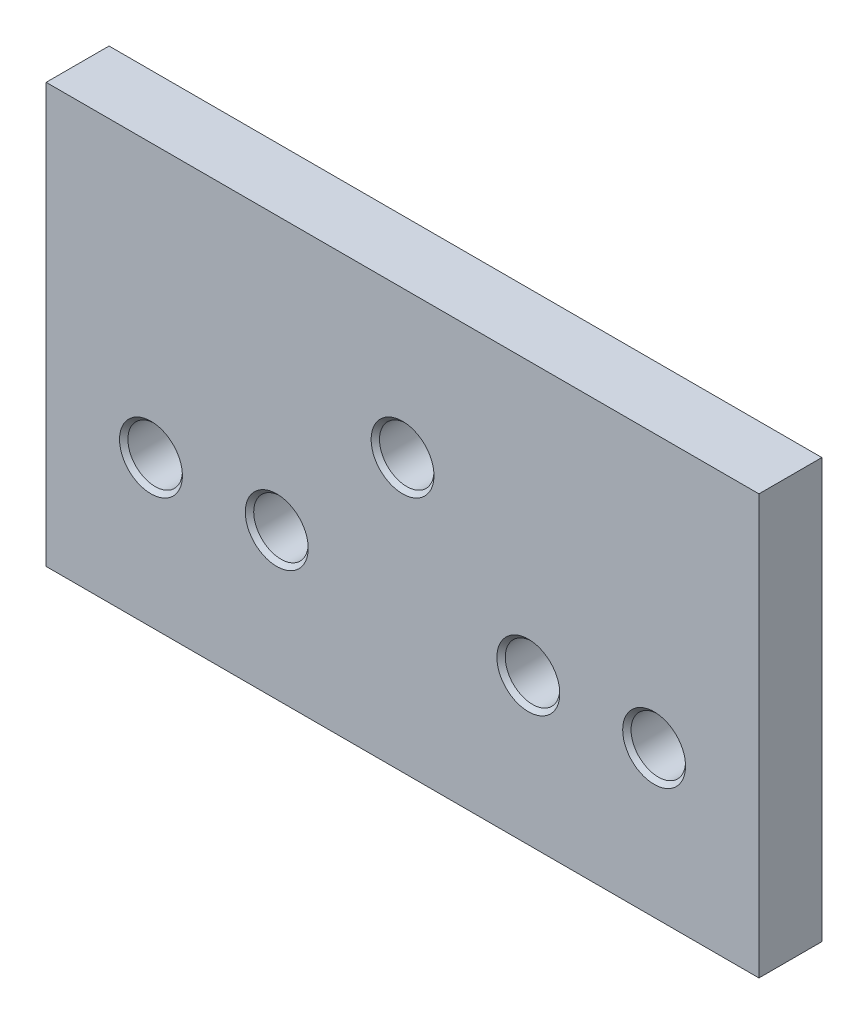
ISO-10303-21;
HEADER;
FILE_DESCRIPTION(('STEP AP214'),'2;1');
FILE_NAME('part.step','',(''),(''),'','','');
FILE_SCHEMA(('AUTOMOTIVE_DESIGN { 1 0 10303 214 1 1 1 1 }'));
ENDSEC;
DATA;
#1=APPLICATION_CONTEXT('core data for automotive mechanical design processes');
#2=APPLICATION_PROTOCOL_DEFINITION('international standard','automotive_design',2000,#1);
#3=PRODUCT_CONTEXT('',#1,'mechanical');
#4=PRODUCT('Part','Part','',(#3));
#5=PRODUCT_RELATED_PRODUCT_CATEGORY('part','',(#4));
#6=PRODUCT_DEFINITION_FORMATION('','',#4);
#7=PRODUCT_DEFINITION_CONTEXT('part definition',#1,'design');
#8=PRODUCT_DEFINITION('design','',#6,#7);
#9=PRODUCT_DEFINITION_SHAPE('','',#8);
#10=(LENGTH_UNIT() NAMED_UNIT(*) SI_UNIT(.MILLI.,.METRE.));
#11=(NAMED_UNIT(*) PLANE_ANGLE_UNIT() SI_UNIT($,.RADIAN.));
#12=(NAMED_UNIT(*) SI_UNIT($,.STERADIAN.) SOLID_ANGLE_UNIT());
#13=UNCERTAINTY_MEASURE_WITH_UNIT(LENGTH_MEASURE(1.E-05),#10,'distance_accuracy_value','');
#14=(GEOMETRIC_REPRESENTATION_CONTEXT(3) GLOBAL_UNCERTAINTY_ASSIGNED_CONTEXT((#13)) GLOBAL_UNIT_ASSIGNED_CONTEXT((#10,
#11,#12)) REPRESENTATION_CONTEXT('',''));
#15=CARTESIAN_POINT('',(0.,0.,0.));
#16=DIRECTION('',(0.,0.,1.));
#17=DIRECTION('',(1.,0.,0.));
#18=AXIS2_PLACEMENT_3D('',#15,#16,#17);
#19=CARTESIAN_POINT('',(0.,0.,3.));
#20=DIRECTION('',(0.,0.,-1.));
#21=DIRECTION('',(-1.,0.,0.));
#22=AXIS2_PLACEMENT_3D('',#19,#20,#21);
#23=PLANE('',#22);
#24=CARTESIAN_POINT('',(12.,-3.,3.));
#25=DIRECTION('',(0.,0.,-1.));
#26=DIRECTION('',(-1.,0.,0.));
#27=AXIS2_PLACEMENT_3D('',#24,#25,#26);
#28=CIRCLE('',#27,1.5);
#29=CARTESIAN_POINT('',(10.5,-3.,3.));
#30=VERTEX_POINT('',#29);
#31=EDGE_CURVE('E151',#30,#30,#28,.T.);
#32=ORIENTED_EDGE('',*,*,#31,.T.);
#33=EDGE_LOOP('',(#32));
#34=FACE_BOUND('',#33,.T.);
#35=CARTESIAN_POINT('',(6.,-3.,3.));
#36=DIRECTION('',(0.,0.,-1.));
#37=DIRECTION('',(-1.,0.,0.));
#38=AXIS2_PLACEMENT_3D('',#35,#36,#37);
#39=CIRCLE('',#38,1.5);
#40=CARTESIAN_POINT('',(4.5,-3.,3.));
#41=VERTEX_POINT('',#40);
#42=EDGE_CURVE('E147',#41,#41,#39,.T.);
#43=ORIENTED_EDGE('',*,*,#42,.T.);
#44=EDGE_LOOP('',(#43));
#45=FACE_BOUND('',#44,.T.);
#46=CARTESIAN_POINT('',(0.,3.,3.));
#47=DIRECTION('',(0.,0.,-1.));
#48=DIRECTION('',(-1.,0.,0.));
#49=AXIS2_PLACEMENT_3D('',#46,#47,#48);
#50=CIRCLE('',#49,1.5);
#51=CARTESIAN_POINT('',(-1.5,3.,3.));
#52=VERTEX_POINT('',#51);
#53=EDGE_CURVE('E143',#52,#52,#50,.T.);
#54=ORIENTED_EDGE('',*,*,#53,.T.);
#55=EDGE_LOOP('',(#54));
#56=FACE_BOUND('',#55,.T.);
#57=CARTESIAN_POINT('',(-6.,-3.,3.));
#58=DIRECTION('',(0.,0.,-1.));
#59=DIRECTION('',(-1.,0.,0.));
#60=AXIS2_PLACEMENT_3D('',#57,#58,#59);
#61=CIRCLE('',#60,1.5);
#62=CARTESIAN_POINT('',(-7.5,-3.,3.));
#63=VERTEX_POINT('',#62);
#64=EDGE_CURVE('E139',#63,#63,#61,.T.);
#65=ORIENTED_EDGE('',*,*,#64,.T.);
#66=EDGE_LOOP('',(#65));
#67=FACE_BOUND('',#66,.T.);
#68=CARTESIAN_POINT('',(-12.,-3.,3.));
#69=DIRECTION('',(0.,0.,-1.));
#70=DIRECTION('',(-1.,0.,0.));
#71=AXIS2_PLACEMENT_3D('',#68,#69,#70);
#72=CIRCLE('',#71,1.5);
#73=CARTESIAN_POINT('',(-13.5,-3.,3.));
#74=VERTEX_POINT('',#73);
#75=EDGE_CURVE('E135',#74,#74,#72,.T.);
#76=ORIENTED_EDGE('',*,*,#75,.T.);
#77=EDGE_LOOP('',(#76));
#78=FACE_BOUND('',#77,.T.);
#79=DIRECTION('',(0.,1.,0.));
#80=VECTOR('',#79,1.);
#81=CARTESIAN_POINT('',(17.,-10.,3.));
#82=LINE('',#81,#80);
#83=CARTESIAN_POINT('',(17.,-10.,3.));
#84=VERTEX_POINT('',#83);
#85=CARTESIAN_POINT('',(17.,10.,3.));
#86=VERTEX_POINT('',#85);
#87=EDGE_CURVE('E95',#84,#86,#82,.T.);
#88=ORIENTED_EDGE('',*,*,#87,.T.);
#89=DIRECTION('',(-1.,0.,0.));
#90=VECTOR('',#89,1.);
#91=CARTESIAN_POINT('',(-17.,10.,3.));
#92=LINE('',#91,#90);
#93=CARTESIAN_POINT('',(-17.,10.,3.));
#94=VERTEX_POINT('',#93);
#95=EDGE_CURVE('E91',#86,#94,#92,.T.);
#96=ORIENTED_EDGE('',*,*,#95,.T.);
#97=DIRECTION('',(0.,-1.,0.));
#98=VECTOR('',#97,1.);
#99=CARTESIAN_POINT('',(-17.,-10.,3.));
#100=LINE('',#99,#98);
#101=CARTESIAN_POINT('',(-17.,-10.,3.));
#102=VERTEX_POINT('',#101);
#103=EDGE_CURVE('E93',#94,#102,#100,.T.);
#104=ORIENTED_EDGE('',*,*,#103,.T.);
#105=DIRECTION('',(1.,0.,0.));
#106=VECTOR('',#105,1.);
#107=CARTESIAN_POINT('',(-17.,-10.,3.));
#108=LINE('',#107,#106);
#109=EDGE_CURVE('E60',#102,#84,#108,.T.);
#110=ORIENTED_EDGE('',*,*,#109,.T.);
#111=EDGE_LOOP('',(#88,#96,#104,#110));
#112=FACE_BOUND('',#111,.T.);
#113=ADVANCED_FACE('F41',(#34,#45,#56,#67,#78,#112),#23,.F.);
#114=CARTESIAN_POINT('',(0.,0.,0.));
#115=DIRECTION('',(0.,0.,-1.));
#116=DIRECTION('',(-1.,0.,0.));
#117=AXIS2_PLACEMENT_3D('',#114,#115,#116);
#118=PLANE('',#117);
#119=CARTESIAN_POINT('',(-6.,-3.,0.));
#120=DIRECTION('',(0.,0.,1.));
#121=DIRECTION('',(1.,0.,0.));
#122=AXIS2_PLACEMENT_3D('',#119,#120,#121);
#123=CIRCLE('',#122,1.3);
#124=CARTESIAN_POINT('',(-4.7,-3.,0.));
#125=VERTEX_POINT('',#124);
#126=EDGE_CURVE('E245',#125,#125,#123,.T.);
#127=ORIENTED_EDGE('',*,*,#126,.T.);
#128=EDGE_LOOP('',(#127));
#129=FACE_BOUND('',#128,.T.);
#130=CARTESIAN_POINT('',(0.,3.,0.));
#131=DIRECTION('',(0.,0.,1.));
#132=DIRECTION('',(1.,0.,0.));
#133=AXIS2_PLACEMENT_3D('',#130,#131,#132);
#134=CIRCLE('',#133,1.3);
#135=CARTESIAN_POINT('',(1.3,3.,0.));
#136=VERTEX_POINT('',#135);
#137=EDGE_CURVE('E244',#136,#136,#134,.T.);
#138=ORIENTED_EDGE('',*,*,#137,.T.);
#139=EDGE_LOOP('',(#138));
#140=FACE_BOUND('',#139,.T.);
#141=DIRECTION('',(0.,1.,0.));
#142=VECTOR('',#141,1.);
#143=CARTESIAN_POINT('',(17.,-10.,0.));
#144=LINE('',#143,#142);
#145=CARTESIAN_POINT('',(17.,-10.,0.));
#146=VERTEX_POINT('',#145);
#147=CARTESIAN_POINT('',(17.,10.,0.));
#148=VERTEX_POINT('',#147);
#149=EDGE_CURVE('E114',#146,#148,#144,.T.);
#150=ORIENTED_EDGE('',*,*,#149,.F.);
#151=DIRECTION('',(1.,0.,0.));
#152=VECTOR('',#151,1.);
#153=CARTESIAN_POINT('',(-17.,-10.,0.));
#154=LINE('',#153,#152);
#155=CARTESIAN_POINT('',(-17.,-10.,0.));
#156=VERTEX_POINT('',#155);
#157=EDGE_CURVE('E83',#156,#146,#154,.T.);
#158=ORIENTED_EDGE('',*,*,#157,.F.);
#159=DIRECTION('',(0.,-1.,0.));
#160=VECTOR('',#159,1.);
#161=CARTESIAN_POINT('',(-17.,-10.,0.));
#162=LINE('',#161,#160);
#163=CARTESIAN_POINT('',(-17.,10.,0.));
#164=VERTEX_POINT('',#163);
#165=EDGE_CURVE('E77',#164,#156,#162,.T.);
#166=ORIENTED_EDGE('',*,*,#165,.F.);
#167=DIRECTION('',(-1.,0.,0.));
#168=VECTOR('',#167,1.);
#169=CARTESIAN_POINT('',(-17.,10.,0.));
#170=LINE('',#169,#168);
#171=EDGE_CURVE('E101',#148,#164,#170,.T.);
#172=ORIENTED_EDGE('',*,*,#171,.F.);
#173=EDGE_LOOP('',(#150,#158,#166,#172));
#174=FACE_BOUND('',#173,.T.);
#175=CARTESIAN_POINT('',(-12.,-3.,0.));
#176=DIRECTION('',(0.,0.,1.));
#177=DIRECTION('',(1.,0.,0.));
#178=AXIS2_PLACEMENT_3D('',#175,#176,#177);
#179=CIRCLE('',#178,1.3);
#180=CARTESIAN_POINT('',(-10.7,-3.,0.));
#181=VERTEX_POINT('',#180);
#182=EDGE_CURVE('E118',#181,#181,#179,.T.);
#183=ORIENTED_EDGE('',*,*,#182,.T.);
#184=EDGE_LOOP('',(#183));
#185=FACE_BOUND('',#184,.T.);
#186=CARTESIAN_POINT('',(6.,-3.,0.));
#187=DIRECTION('',(0.,0.,1.));
#188=DIRECTION('',(1.,0.,0.));
#189=AXIS2_PLACEMENT_3D('',#186,#187,#188);
#190=CIRCLE('',#189,1.3);
#191=CARTESIAN_POINT('',(7.3,-3.,0.));
#192=VERTEX_POINT('',#191);
#193=EDGE_CURVE('E241',#192,#192,#190,.T.);
#194=ORIENTED_EDGE('',*,*,#193,.T.);
#195=EDGE_LOOP('',(#194));
#196=FACE_BOUND('',#195,.T.);
#197=CARTESIAN_POINT('',(12.,-3.,0.));
#198=DIRECTION('',(0.,0.,1.));
#199=DIRECTION('',(1.,0.,0.));
#200=AXIS2_PLACEMENT_3D('',#197,#198,#199);
#201=CIRCLE('',#200,1.3);
#202=CARTESIAN_POINT('',(13.3,-3.,0.));
#203=VERTEX_POINT('',#202);
#204=EDGE_CURVE('E252',#203,#203,#201,.T.);
#205=ORIENTED_EDGE('',*,*,#204,.T.);
#206=EDGE_LOOP('',(#205));
#207=FACE_BOUND('',#206,.T.);
#208=ADVANCED_FACE('F184',(#129,#140,#174,#185,#196,#207),#118,.T.);
#209=CARTESIAN_POINT('',(17.,-10.,3.));
#210=DIRECTION('',(-1.,0.,0.));
#211=DIRECTION('',(0.,0.,1.));
#212=AXIS2_PLACEMENT_3D('',#209,#210,#211);
#213=PLANE('',#212);
#214=ORIENTED_EDGE('',*,*,#149,.T.);
#215=DIRECTION('',(0.,0.,-1.));
#216=VECTOR('',#215,1.);
#217=CARTESIAN_POINT('',(17.,10.,3.));
#218=LINE('',#217,#216);
#219=EDGE_CURVE('E103',#86,#148,#218,.T.);
#220=ORIENTED_EDGE('',*,*,#219,.F.);
#221=ORIENTED_EDGE('',*,*,#87,.F.);
#222=DIRECTION('',(0.,0.,-1.));
#223=VECTOR('',#222,1.);
#224=CARTESIAN_POINT('',(17.,-10.,3.));
#225=LINE('',#224,#223);
#226=EDGE_CURVE('E110',#84,#146,#225,.T.);
#227=ORIENTED_EDGE('',*,*,#226,.T.);
#228=EDGE_LOOP('',(#214,#220,#221,#227));
#229=FACE_BOUND('',#228,.T.);
#230=ADVANCED_FACE('F190',(#229),#213,.F.);
#231=CARTESIAN_POINT('',(-17.,10.,3.));
#232=DIRECTION('',(0.,-1.,0.));
#233=DIRECTION('',(0.,0.,-1.));
#234=AXIS2_PLACEMENT_3D('',#231,#232,#233);
#235=PLANE('',#234);
#236=ORIENTED_EDGE('',*,*,#171,.T.);
#237=DIRECTION('',(0.,0.,-1.));
#238=VECTOR('',#237,1.);
#239=CARTESIAN_POINT('',(-17.,10.,3.));
#240=LINE('',#239,#238);
#241=EDGE_CURVE('E99',#94,#164,#240,.T.);
#242=ORIENTED_EDGE('',*,*,#241,.F.);
#243=ORIENTED_EDGE('',*,*,#95,.F.);
#244=ORIENTED_EDGE('',*,*,#219,.T.);
#245=EDGE_LOOP('',(#236,#242,#243,#244));
#246=FACE_BOUND('',#245,.T.);
#247=ADVANCED_FACE('F100',(#246),#235,.F.);
#248=CARTESIAN_POINT('',(-17.,-10.,3.));
#249=DIRECTION('',(1.,0.,0.));
#250=DIRECTION('',(0.,0.,-1.));
#251=AXIS2_PLACEMENT_3D('',#248,#249,#250);
#252=PLANE('',#251);
#253=ORIENTED_EDGE('',*,*,#165,.T.);
#254=DIRECTION('',(0.,0.,-1.));
#255=VECTOR('',#254,1.);
#256=CARTESIAN_POINT('',(-17.,-10.,3.));
#257=LINE('',#256,#255);
#258=EDGE_CURVE('E104',#102,#156,#257,.T.);
#259=ORIENTED_EDGE('',*,*,#258,.F.);
#260=ORIENTED_EDGE('',*,*,#103,.F.);
#261=ORIENTED_EDGE('',*,*,#241,.T.);
#262=EDGE_LOOP('',(#253,#259,#260,#261));
#263=FACE_BOUND('',#262,.T.);
#264=ADVANCED_FACE('F106',(#263),#252,.F.);
#265=CARTESIAN_POINT('',(-17.,-10.,3.));
#266=DIRECTION('',(0.,1.,0.));
#267=DIRECTION('',(0.,0.,1.));
#268=AXIS2_PLACEMENT_3D('',#265,#266,#267);
#269=PLANE('',#268);
#270=ORIENTED_EDGE('',*,*,#157,.T.);
#271=ORIENTED_EDGE('',*,*,#226,.F.);
#272=ORIENTED_EDGE('',*,*,#109,.F.);
#273=ORIENTED_EDGE('',*,*,#258,.T.);
#274=EDGE_LOOP('',(#270,#271,#272,#273));
#275=FACE_BOUND('',#274,.T.);
#276=ADVANCED_FACE('F198',(#275),#269,.F.);
#277=CARTESIAN_POINT('',(-12.,-3.,3.));
#278=DIRECTION('',(0.,0.,-1.));
#279=DIRECTION('',(-1.,0.,0.));
#280=AXIS2_PLACEMENT_3D('',#277,#278,#279);
#281=CYLINDRICAL_SURFACE('',#280,1.3);
#282=CARTESIAN_POINT('',(-12.,-3.,2.8));
#283=DIRECTION('',(0.,0.,-1.));
#284=DIRECTION('',(-1.,0.,0.));
#285=AXIS2_PLACEMENT_3D('',#282,#283,#284);
#286=CIRCLE('',#285,1.3);
#287=CARTESIAN_POINT('',(-13.3,-3.,2.8));
#288=VERTEX_POINT('',#287);
#289=EDGE_CURVE('E11',#288,#288,#286,.F.);
#290=ORIENTED_EDGE('',*,*,#289,.T.);
#291=EDGE_LOOP('',(#290));
#292=FACE_BOUND('',#291,.T.);
#293=ORIENTED_EDGE('',*,*,#182,.F.);
#294=EDGE_LOOP('',(#293));
#295=FACE_BOUND('',#294,.T.);
#296=ADVANCED_FACE('F195',(#292,#295),#281,.F.);
#297=CARTESIAN_POINT('',(0.,3.,3.));
#298=DIRECTION('',(0.,0.,-1.));
#299=DIRECTION('',(-1.,0.,0.));
#300=AXIS2_PLACEMENT_3D('',#297,#298,#299);
#301=CYLINDRICAL_SURFACE('',#300,1.3);
#302=CARTESIAN_POINT('',(0.,3.,2.79999999999999));
#303=DIRECTION('',(0.,0.,-1.));
#304=DIRECTION('',(-1.,0.,0.));
#305=AXIS2_PLACEMENT_3D('',#302,#303,#304);
#306=CIRCLE('',#305,1.3);
#307=CARTESIAN_POINT('',(-1.3,3.,2.79999999999999));
#308=VERTEX_POINT('',#307);
#309=EDGE_CURVE('E159',#308,#308,#306,.F.);
#310=ORIENTED_EDGE('',*,*,#309,.T.);
#311=EDGE_LOOP('',(#310));
#312=FACE_BOUND('',#311,.T.);
#313=ORIENTED_EDGE('',*,*,#137,.F.);
#314=EDGE_LOOP('',(#313));
#315=FACE_BOUND('',#314,.T.);
#316=ADVANCED_FACE('F237',(#312,#315),#301,.F.);
#317=CARTESIAN_POINT('',(6.,-3.,3.));
#318=DIRECTION('',(0.,0.,-1.));
#319=DIRECTION('',(-1.,0.,0.));
#320=AXIS2_PLACEMENT_3D('',#317,#318,#319);
#321=CYLINDRICAL_SURFACE('',#320,1.3);
#322=CARTESIAN_POINT('',(6.,-3.,2.79999999999999));
#323=DIRECTION('',(0.,0.,-1.));
#324=DIRECTION('',(-1.,0.,0.));
#325=AXIS2_PLACEMENT_3D('',#322,#323,#324);
#326=CIRCLE('',#325,1.3);
#327=CARTESIAN_POINT('',(4.7,-3.,2.79999999999999));
#328=VERTEX_POINT('',#327);
#329=EDGE_CURVE('E155',#328,#328,#326,.F.);
#330=ORIENTED_EDGE('',*,*,#329,.T.);
#331=EDGE_LOOP('',(#330));
#332=FACE_BOUND('',#331,.T.);
#333=ORIENTED_EDGE('',*,*,#193,.F.);
#334=EDGE_LOOP('',(#333));
#335=FACE_BOUND('',#334,.T.);
#336=ADVANCED_FACE('F234',(#332,#335),#321,.F.);
#337=CARTESIAN_POINT('',(-6.,-3.,3.));
#338=DIRECTION('',(0.,0.,-1.));
#339=DIRECTION('',(-1.,0.,0.));
#340=AXIS2_PLACEMENT_3D('',#337,#338,#339);
#341=CYLINDRICAL_SURFACE('',#340,1.3);
#342=CARTESIAN_POINT('',(-6.,-3.,2.79999999999999));
#343=DIRECTION('',(0.,0.,-1.));
#344=DIRECTION('',(-1.,0.,0.));
#345=AXIS2_PLACEMENT_3D('',#342,#343,#344);
#346=CIRCLE('',#345,1.3);
#347=CARTESIAN_POINT('',(-7.3,-3.,2.79999999999999));
#348=VERTEX_POINT('',#347);
#349=EDGE_CURVE('E52',#348,#348,#346,.F.);
#350=ORIENTED_EDGE('',*,*,#349,.T.);
#351=EDGE_LOOP('',(#350));
#352=FACE_BOUND('',#351,.T.);
#353=ORIENTED_EDGE('',*,*,#126,.F.);
#354=EDGE_LOOP('',(#353));
#355=FACE_BOUND('',#354,.T.);
#356=ADVANCED_FACE('F166',(#352,#355),#341,.F.);
#357=CARTESIAN_POINT('',(12.,-3.,3.));
#358=DIRECTION('',(0.,0.,-1.));
#359=DIRECTION('',(-1.,0.,0.));
#360=AXIS2_PLACEMENT_3D('',#357,#358,#359);
#361=CYLINDRICAL_SURFACE('',#360,1.3);
#362=CARTESIAN_POINT('',(12.,-3.,2.8));
#363=DIRECTION('',(0.,0.,-1.));
#364=DIRECTION('',(-1.,0.,0.));
#365=AXIS2_PLACEMENT_3D('',#362,#363,#364);
#366=CIRCLE('',#365,1.3);
#367=CARTESIAN_POINT('',(10.7,-3.,2.8));
#368=VERTEX_POINT('',#367);
#369=EDGE_CURVE('E131',#368,#368,#366,.F.);
#370=ORIENTED_EDGE('',*,*,#369,.T.);
#371=EDGE_LOOP('',(#370));
#372=FACE_BOUND('',#371,.T.);
#373=ORIENTED_EDGE('',*,*,#204,.F.);
#374=EDGE_LOOP('',(#373));
#375=FACE_BOUND('',#374,.T.);
#376=ADVANCED_FACE('F215',(#372,#375),#361,.F.);
#377=CARTESIAN_POINT('',(12.,-3.,2.8));
#378=DIRECTION('',(0.,0.,1.));
#379=DIRECTION('',(1.,0.,0.));
#380=AXIS2_PLACEMENT_3D('',#377,#378,#379);
#381=CONICAL_SURFACE('',#380,1.3,0.785398163397453);
#382=ORIENTED_EDGE('',*,*,#31,.F.);
#383=EDGE_LOOP('',(#382));
#384=FACE_BOUND('',#383,.T.);
#385=ORIENTED_EDGE('',*,*,#369,.F.);
#386=EDGE_LOOP('',(#385));
#387=FACE_BOUND('',#386,.T.);
#388=ADVANCED_FACE('F209',(#384,#387),#381,.F.);
#389=CARTESIAN_POINT('',(6.,-3.,2.79999999999999));
#390=DIRECTION('',(0.,0.,1.));
#391=DIRECTION('',(1.,0.,0.));
#392=AXIS2_PLACEMENT_3D('',#389,#390,#391);
#393=CONICAL_SURFACE('',#392,1.3,0.785398163397447);
#394=ORIENTED_EDGE('',*,*,#42,.F.);
#395=EDGE_LOOP('',(#394));
#396=FACE_BOUND('',#395,.T.);
#397=ORIENTED_EDGE('',*,*,#329,.F.);
#398=EDGE_LOOP('',(#397));
#399=FACE_BOUND('',#398,.T.);
#400=ADVANCED_FACE('F178',(#396,#399),#393,.F.);
#401=CARTESIAN_POINT('',(0.,3.,2.79999999999999));
#402=DIRECTION('',(0.,0.,1.));
#403=DIRECTION('',(1.,0.,0.));
#404=AXIS2_PLACEMENT_3D('',#401,#402,#403);
#405=CONICAL_SURFACE('',#404,1.3,0.785398163397445);
#406=ORIENTED_EDGE('',*,*,#53,.F.);
#407=EDGE_LOOP('',(#406));
#408=FACE_BOUND('',#407,.T.);
#409=ORIENTED_EDGE('',*,*,#309,.F.);
#410=EDGE_LOOP('',(#409));
#411=FACE_BOUND('',#410,.T.);
#412=ADVANCED_FACE('F171',(#408,#411),#405,.F.);
#413=CARTESIAN_POINT('',(-6.,-3.,2.79999999999999));
#414=DIRECTION('',(0.,0.,1.));
#415=DIRECTION('',(1.,0.,0.));
#416=AXIS2_PLACEMENT_3D('',#413,#414,#415);
#417=CONICAL_SURFACE('',#416,1.3,0.785398163397447);
#418=ORIENTED_EDGE('',*,*,#64,.F.);
#419=EDGE_LOOP('',(#418));
#420=FACE_BOUND('',#419,.T.);
#421=ORIENTED_EDGE('',*,*,#349,.F.);
#422=EDGE_LOOP('',(#421));
#423=FACE_BOUND('',#422,.T.);
#424=ADVANCED_FACE('F169',(#420,#423),#417,.F.);
#425=CARTESIAN_POINT('',(-12.,-3.,2.8));
#426=DIRECTION('',(0.,0.,1.));
#427=DIRECTION('',(1.,0.,0.));
#428=AXIS2_PLACEMENT_3D('',#425,#426,#427);
#429=CONICAL_SURFACE('',#428,1.3,0.785398163397453);
#430=ORIENTED_EDGE('',*,*,#75,.F.);
#431=EDGE_LOOP('',(#430));
#432=FACE_BOUND('',#431,.T.);
#433=ORIENTED_EDGE('',*,*,#289,.F.);
#434=EDGE_LOOP('',(#433));
#435=FACE_BOUND('',#434,.T.);
#436=ADVANCED_FACE('F44',(#432,#435),#429,.F.);
#437=CLOSED_SHELL('',(#113,#208,#230,#247,#264,#276,#296,#316,#336,#356,#376,#388,#400,#412,
#424,#436));
#438=MANIFOLD_SOLID_BREP('B2',#437);
#439=ADVANCED_BREP_SHAPE_REPRESENTATION('',(#18,#438),#14);
#440=SHAPE_DEFINITION_REPRESENTATION(#9,#439);
ENDSEC;
END-ISO-10303-21;
